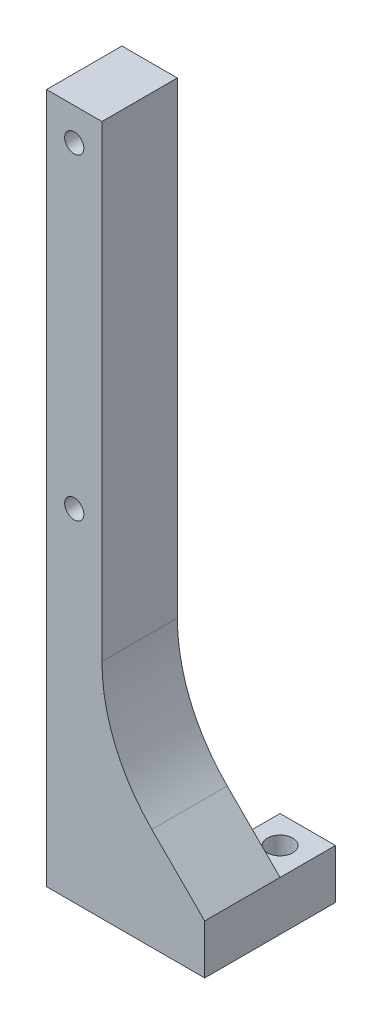
ISO-10303-21;
HEADER;
FILE_DESCRIPTION(('STEP AP214'),'2;1');
FILE_NAME('part.step','',(''),(''),'','','');
FILE_SCHEMA(('AUTOMOTIVE_DESIGN { 1 0 10303 214 1 1 1 1 }'));
ENDSEC;
DATA;
#1=APPLICATION_CONTEXT('core data for automotive mechanical design processes');
#2=APPLICATION_PROTOCOL_DEFINITION('international standard','automotive_design',2000,#1);
#3=PRODUCT_CONTEXT('',#1,'mechanical');
#4=PRODUCT('Part','Part','',(#3));
#5=PRODUCT_RELATED_PRODUCT_CATEGORY('part','',(#4));
#6=PRODUCT_DEFINITION_FORMATION('','',#4);
#7=PRODUCT_DEFINITION_CONTEXT('part definition',#1,'design');
#8=PRODUCT_DEFINITION('design','',#6,#7);
#9=PRODUCT_DEFINITION_SHAPE('','',#8);
#10=(LENGTH_UNIT() NAMED_UNIT(*) SI_UNIT(.MILLI.,.METRE.));
#11=(NAMED_UNIT(*) PLANE_ANGLE_UNIT() SI_UNIT($,.RADIAN.));
#12=(NAMED_UNIT(*) SI_UNIT($,.STERADIAN.) SOLID_ANGLE_UNIT());
#13=UNCERTAINTY_MEASURE_WITH_UNIT(LENGTH_MEASURE(1.E-05),#10,'distance_accuracy_value','');
#14=(GEOMETRIC_REPRESENTATION_CONTEXT(3) GLOBAL_UNCERTAINTY_ASSIGNED_CONTEXT((#13)) GLOBAL_UNIT_ASSIGNED_CONTEXT((#10,
#11,#12)) REPRESENTATION_CONTEXT('',''));
#15=CARTESIAN_POINT('',(0.,0.,0.));
#16=DIRECTION('',(0.,0.,1.));
#17=DIRECTION('',(1.,0.,0.));
#18=AXIS2_PLACEMENT_3D('',#15,#16,#17);
#19=CARTESIAN_POINT('',(18.56,40.05,-3.25));
#20=DIRECTION('',(0.,0.,1.));
#21=DIRECTION('',(-1.,0.,0.));
#22=AXIS2_PLACEMENT_3D('',#19,#20,#21);
#23=CYLINDRICAL_SURFACE('',#22,1.125);
#24=CARTESIAN_POINT('',(18.56,40.05,12.1));
#25=DIRECTION('',(0.,0.,-1.));
#26=DIRECTION('',(-1.,0.,0.));
#27=AXIS2_PLACEMENT_3D('',#24,#25,#26);
#28=CIRCLE('',#27,1.125);
#29=CARTESIAN_POINT('',(17.435,40.05,12.1));
#30=VERTEX_POINT('',#29);
#31=EDGE_CURVE('E234',#30,#30,#28,.T.);
#32=ORIENTED_EDGE('',*,*,#31,.F.);
#33=EDGE_LOOP('',(#32));
#34=FACE_BOUND('',#33,.T.);
#35=CARTESIAN_POINT('',(18.56,40.05,5.25));
#36=DIRECTION('',(0.,0.,1.));
#37=DIRECTION('',(1.,0.,0.));
#38=AXIS2_PLACEMENT_3D('',#35,#36,#37);
#39=CIRCLE('',#38,1.125);
#40=CARTESIAN_POINT('',(19.685,40.05,5.25));
#41=VERTEX_POINT('',#40);
#42=EDGE_CURVE('E242',#41,#41,#39,.F.);
#43=ORIENTED_EDGE('',*,*,#42,.T.);
#44=EDGE_LOOP('',(#43));
#45=FACE_BOUND('',#44,.T.);
#46=ADVANCED_FACE('F37',(#34,#45),#23,.F.);
#47=CARTESIAN_POINT('',(18.56,77.25,-3.25));
#48=DIRECTION('',(0.,0.,1.));
#49=DIRECTION('',(-1.,0.,0.));
#50=AXIS2_PLACEMENT_3D('',#47,#48,#49);
#51=CYLINDRICAL_SURFACE('',#50,1.125);
#52=CARTESIAN_POINT('',(18.56,77.25,12.1));
#53=DIRECTION('',(0.,0.,-1.));
#54=DIRECTION('',(-1.,0.,0.));
#55=AXIS2_PLACEMENT_3D('',#52,#53,#54);
#56=CIRCLE('',#55,1.125);
#57=CARTESIAN_POINT('',(17.435,77.25,12.1));
#58=VERTEX_POINT('',#57);
#59=EDGE_CURVE('E285',#58,#58,#56,.T.);
#60=ORIENTED_EDGE('',*,*,#59,.F.);
#61=EDGE_LOOP('',(#60));
#62=FACE_BOUND('',#61,.T.);
#63=CARTESIAN_POINT('',(18.56,77.25,5.25));
#64=DIRECTION('',(0.,0.,1.));
#65=DIRECTION('',(1.,0.,0.));
#66=AXIS2_PLACEMENT_3D('',#63,#64,#65);
#67=CIRCLE('',#66,1.125);
#68=CARTESIAN_POINT('',(19.685,77.25,5.25));
#69=VERTEX_POINT('',#68);
#70=EDGE_CURVE('E206',#69,#69,#67,.F.);
#71=ORIENTED_EDGE('',*,*,#70,.T.);
#72=EDGE_LOOP('',(#71));
#73=FACE_BOUND('',#72,.T.);
#74=ADVANCED_FACE('F424',(#62,#73),#51,.F.);
#75=CARTESIAN_POINT('',(41.81,26.1442712474619,-13.8054155622195));
#76=DIRECTION('',(0.,0.,1.));
#77=DIRECTION('',(-1.,0.,0.));
#78=AXIS2_PLACEMENT_3D('',#75,#76,#77);
#79=CYLINDRICAL_SURFACE('',#78,20.);
#80=DIRECTION('',(0.,0.,-1.));
#81=VECTOR('',#80,1.);
#82=CARTESIAN_POINT('',(27.667864376269,12.002135623731,-13.8054155622195));
#83=LINE('',#82,#81);
#84=CARTESIAN_POINT('',(27.6678643762691,12.002135623731,12.1));
#85=VERTEX_POINT('',#84);
#86=CARTESIAN_POINT('',(27.6678643762691,12.002135623731,3.24999999999999));
#87=VERTEX_POINT('',#86);
#88=EDGE_CURVE('E359',#85,#87,#83,.T.);
#89=ORIENTED_EDGE('',*,*,#88,.T.);
#90=CARTESIAN_POINT('',(41.81,26.1442712474619,3.24999999999999));
#91=DIRECTION('',(0.,0.,1.));
#92=DIRECTION('',(1.,0.,0.));
#93=AXIS2_PLACEMENT_3D('',#90,#91,#92);
#94=CIRCLE('',#93,20.);
#95=CARTESIAN_POINT('',(21.81,26.1442712474619,3.25));
#96=VERTEX_POINT('',#95);
#97=EDGE_CURVE('E11',#96,#87,#94,.T.);
#98=ORIENTED_EDGE('',*,*,#97,.F.);
#99=DIRECTION('',(0.,0.,-1.));
#100=VECTOR('',#99,1.);
#101=CARTESIAN_POINT('',(21.81,26.1442712474619,-13.8054155622195));
#102=LINE('',#101,#100);
#103=CARTESIAN_POINT('',(21.81,26.1442712474619,12.1));
#104=VERTEX_POINT('',#103);
#105=EDGE_CURVE('E362',#96,#104,#102,.F.);
#106=ORIENTED_EDGE('',*,*,#105,.T.);
#107=CARTESIAN_POINT('',(41.81,26.1442712474619,12.1));
#108=DIRECTION('',(0.,0.,-1.));
#109=DIRECTION('',(-1.,0.,0.));
#110=AXIS2_PLACEMENT_3D('',#107,#108,#109);
#111=CIRCLE('',#110,20.);
#112=EDGE_CURVE('E45',#85,#104,#111,.T.);
#113=ORIENTED_EDGE('',*,*,#112,.F.);
#114=EDGE_LOOP('',(#89,#98,#106,#113));
#115=FACE_BOUND('',#114,.T.);
#116=ADVANCED_FACE('F39',(#115),#79,.F.);
#117=CARTESIAN_POINT('',(30.62,5.8,0.));
#118=DIRECTION('',(0.,1.,0.));
#119=DIRECTION('',(0.,0.,1.));
#120=AXIS2_PLACEMENT_3D('',#117,#118,#119);
#121=PLANE('',#120);
#122=DIRECTION('',(-1.,0.,0.));
#123=VECTOR('',#122,1.);
#124=CARTESIAN_POINT('',(33.87,5.8,3.24999999999999));
#125=LINE('',#124,#123);
#126=CARTESIAN_POINT('',(33.87,5.8,3.24999999999999));
#127=VERTEX_POINT('',#126);
#128=CARTESIAN_POINT('',(27.37,5.8,3.24999999999999));
#129=VERTEX_POINT('',#128);
#130=EDGE_CURVE('E292',#127,#129,#125,.T.);
#131=ORIENTED_EDGE('',*,*,#130,.F.);
#132=DIRECTION('',(0.,0.,1.));
#133=VECTOR('',#132,1.);
#134=CARTESIAN_POINT('',(33.87,5.8,3.24999999999999));
#135=LINE('',#134,#133);
#136=CARTESIAN_POINT('',(33.87,5.8,-3.25000000000001));
#137=VERTEX_POINT('',#136);
#138=EDGE_CURVE('E341',#137,#127,#135,.T.);
#139=ORIENTED_EDGE('',*,*,#138,.F.);
#140=DIRECTION('',(1.,0.,0.));
#141=VECTOR('',#140,1.);
#142=CARTESIAN_POINT('',(33.87,5.8,-3.25000000000001));
#143=LINE('',#142,#141);
#144=CARTESIAN_POINT('',(27.37,5.8,-3.25));
#145=VERTEX_POINT('',#144);
#146=EDGE_CURVE('E338',#145,#137,#143,.T.);
#147=ORIENTED_EDGE('',*,*,#146,.F.);
#148=DIRECTION('',(0.,0.,-1.));
#149=VECTOR('',#148,1.);
#150=CARTESIAN_POINT('',(27.37,5.8,3.25));
#151=LINE('',#150,#149);
#152=EDGE_CURVE('E345',#129,#145,#151,.T.);
#153=ORIENTED_EDGE('',*,*,#152,.F.);
#154=EDGE_LOOP('',(#131,#139,#147,#153));
#155=FACE_BOUND('',#154,.T.);
#156=CARTESIAN_POINT('',(30.62,5.8,0.));
#157=DIRECTION('',(0.,-1.,0.));
#158=DIRECTION('',(0.,0.,1.));
#159=AXIS2_PLACEMENT_3D('',#156,#157,#158);
#160=CIRCLE('',#159,1.5);
#161=CARTESIAN_POINT('',(30.62,5.8,1.5));
#162=VERTEX_POINT('',#161);
#163=EDGE_CURVE('E332',#162,#162,#160,.T.);
#164=ORIENTED_EDGE('',*,*,#163,.T.);
#165=EDGE_LOOP('',(#164));
#166=FACE_BOUND('',#165,.T.);
#167=ADVANCED_FACE('F409',(#155,#166),#121,.T.);
#168=CARTESIAN_POINT('',(30.62,0.,0.));
#169=DIRECTION('',(0.,1.,0.));
#170=DIRECTION('',(0.,0.,1.));
#171=AXIS2_PLACEMENT_3D('',#168,#169,#170);
#172=PLANE('',#171);
#173=DIRECTION('',(1.,0.,0.));
#174=VECTOR('',#173,1.);
#175=CARTESIAN_POINT('',(33.87,0.,-3.25000000000001));
#176=LINE('',#175,#174);
#177=CARTESIAN_POINT('',(27.37,0.,-3.25));
#178=VERTEX_POINT('',#177);
#179=CARTESIAN_POINT('',(33.87,0.,-3.25000000000001));
#180=VERTEX_POINT('',#179);
#181=EDGE_CURVE('E335',#178,#180,#176,.T.);
#182=ORIENTED_EDGE('',*,*,#181,.T.);
#183=DIRECTION('',(0.,0.,1.));
#184=VECTOR('',#183,1.);
#185=CARTESIAN_POINT('',(33.87,0.,3.24999999999999));
#186=LINE('',#185,#184);
#187=CARTESIAN_POINT('',(33.87,0.,12.1));
#188=VERTEX_POINT('',#187);
#189=EDGE_CURVE('E351',#180,#188,#186,.T.);
#190=ORIENTED_EDGE('',*,*,#189,.T.);
#191=DIRECTION('',(-1.,0.,0.));
#192=VECTOR('',#191,1.);
#193=CARTESIAN_POINT('',(27.37,0.,12.1));
#194=LINE('',#193,#192);
#195=CARTESIAN_POINT('',(15.31,0.,12.1));
#196=VERTEX_POINT('',#195);
#197=EDGE_CURVE('E328',#188,#196,#194,.T.);
#198=ORIENTED_EDGE('',*,*,#197,.T.);
#199=DIRECTION('',(0.,0.,-1.));
#200=VECTOR('',#199,1.);
#201=CARTESIAN_POINT('',(15.31,0.,0.));
#202=LINE('',#201,#200);
#203=CARTESIAN_POINT('',(15.31,0.,3.25));
#204=VERTEX_POINT('',#203);
#205=EDGE_CURVE('E319',#196,#204,#202,.T.);
#206=ORIENTED_EDGE('',*,*,#205,.T.);
#207=DIRECTION('',(1.,0.,0.));
#208=VECTOR('',#207,1.);
#209=CARTESIAN_POINT('',(15.31,0.,3.25));
#210=LINE('',#209,#208);
#211=CARTESIAN_POINT('',(27.37,0.,3.24999999999999));
#212=VERTEX_POINT('',#211);
#213=EDGE_CURVE('E322',#204,#212,#210,.T.);
#214=ORIENTED_EDGE('',*,*,#213,.T.);
#215=DIRECTION('',(0.,0.,-1.));
#216=VECTOR('',#215,1.);
#217=CARTESIAN_POINT('',(27.37,0.,3.25));
#218=LINE('',#217,#216);
#219=EDGE_CURVE('E342',#212,#178,#218,.T.);
#220=ORIENTED_EDGE('',*,*,#219,.T.);
#221=EDGE_LOOP('',(#182,#190,#198,#206,#214,#220));
#222=FACE_BOUND('',#221,.T.);
#223=CARTESIAN_POINT('',(30.62,0.,0.));
#224=DIRECTION('',(0.,-1.,0.));
#225=DIRECTION('',(0.,0.,1.));
#226=AXIS2_PLACEMENT_3D('',#223,#224,#225);
#227=CIRCLE('',#226,1.5);
#228=CARTESIAN_POINT('',(30.62,0.,1.5));
#229=VERTEX_POINT('',#228);
#230=EDGE_CURVE('E331',#229,#229,#227,.T.);
#231=ORIENTED_EDGE('',*,*,#230,.F.);
#232=EDGE_LOOP('',(#231));
#233=FACE_BOUND('',#232,.T.);
#234=ADVANCED_FACE('F389',(#222,#233),#172,.F.);
#235=CARTESIAN_POINT('',(33.87,5.8,-3.25000000000001));
#236=DIRECTION('',(0.,0.,1.));
#237=DIRECTION('',(-1.,0.,0.));
#238=AXIS2_PLACEMENT_3D('',#235,#236,#237);
#239=PLANE('',#238);
#240=ORIENTED_EDGE('',*,*,#181,.F.);
#241=DIRECTION('',(0.,-1.,0.));
#242=VECTOR('',#241,1.);
#243=CARTESIAN_POINT('',(27.37,5.8,-3.25));
#244=LINE('',#243,#242);
#245=EDGE_CURVE('E348',#145,#178,#244,.T.);
#246=ORIENTED_EDGE('',*,*,#245,.F.);
#247=ORIENTED_EDGE('',*,*,#146,.T.);
#248=DIRECTION('',(0.,-1.,0.));
#249=VECTOR('',#248,1.);
#250=CARTESIAN_POINT('',(33.87,5.8,-3.25000000000001));
#251=LINE('',#250,#249);
#252=EDGE_CURVE('E357',#137,#180,#251,.T.);
#253=ORIENTED_EDGE('',*,*,#252,.T.);
#254=EDGE_LOOP('',(#240,#246,#247,#253));
#255=FACE_BOUND('',#254,.T.);
#256=ADVANCED_FACE('F405',(#255),#239,.F.);
#257=CARTESIAN_POINT('',(33.87,5.8,3.24999999999999));
#258=DIRECTION('',(-1.,0.,0.));
#259=DIRECTION('',(0.,0.,-1.));
#260=AXIS2_PLACEMENT_3D('',#257,#258,#259);
#261=PLANE('',#260);
#262=ORIENTED_EDGE('',*,*,#189,.F.);
#263=ORIENTED_EDGE('',*,*,#252,.F.);
#264=ORIENTED_EDGE('',*,*,#138,.T.);
#265=DIRECTION('',(0.,0.,1.));
#266=VECTOR('',#265,1.);
#267=CARTESIAN_POINT('',(33.87,5.8,-13.8054155622195));
#268=LINE('',#267,#266);
#269=CARTESIAN_POINT('',(33.87,5.8,12.1));
#270=VERTEX_POINT('',#269);
#271=EDGE_CURVE('E297',#127,#270,#268,.T.);
#272=ORIENTED_EDGE('',*,*,#271,.T.);
#273=DIRECTION('',(0.,-1.,0.));
#274=VECTOR('',#273,1.);
#275=CARTESIAN_POINT('',(33.87,0.,12.1));
#276=LINE('',#275,#274);
#277=EDGE_CURVE('E326',#270,#188,#276,.T.);
#278=ORIENTED_EDGE('',*,*,#277,.T.);
#279=EDGE_LOOP('',(#262,#263,#264,#272,#278));
#280=FACE_BOUND('',#279,.T.);
#281=ADVANCED_FACE('F394',(#280),#261,.F.);
#282=CARTESIAN_POINT('',(27.37,5.8,3.25));
#283=DIRECTION('',(1.,0.,0.));
#284=DIRECTION('',(0.,0.,1.));
#285=AXIS2_PLACEMENT_3D('',#282,#283,#284);
#286=PLANE('',#285);
#287=ORIENTED_EDGE('',*,*,#152,.T.);
#288=ORIENTED_EDGE('',*,*,#245,.T.);
#289=ORIENTED_EDGE('',*,*,#219,.F.);
#290=DIRECTION('',(0.,-1.,0.));
#291=VECTOR('',#290,1.);
#292=CARTESIAN_POINT('',(27.37,0.,3.24999999999999));
#293=LINE('',#292,#291);
#294=EDGE_CURVE('E314',#129,#212,#293,.T.);
#295=ORIENTED_EDGE('',*,*,#294,.F.);
#296=EDGE_LOOP('',(#287,#288,#289,#295));
#297=FACE_BOUND('',#296,.T.);
#298=ADVANCED_FACE('F411',(#297),#286,.F.);
#299=CARTESIAN_POINT('',(30.62,5.8,0.));
#300=DIRECTION('',(0.,-1.,0.));
#301=DIRECTION('',(0.,0.,-1.));
#302=AXIS2_PLACEMENT_3D('',#299,#300,#301);
#303=CYLINDRICAL_SURFACE('',#302,1.5);
#304=ORIENTED_EDGE('',*,*,#163,.F.);
#305=EDGE_LOOP('',(#304));
#306=FACE_BOUND('',#305,.T.);
#307=ORIENTED_EDGE('',*,*,#230,.T.);
#308=EDGE_LOOP('',(#307));
#309=FACE_BOUND('',#308,.T.);
#310=ADVANCED_FACE('F413',(#306,#309),#303,.F.);
#311=CARTESIAN_POINT('',(30.62,0.,12.1));
#312=DIRECTION('',(0.,0.,1.));
#313=DIRECTION('',(-1.,0.,0.));
#314=AXIS2_PLACEMENT_3D('',#311,#312,#313);
#315=PLANE('',#314);
#316=ORIENTED_EDGE('',*,*,#59,.T.);
#317=EDGE_LOOP('',(#316));
#318=FACE_BOUND('',#317,.T.);
#319=ORIENTED_EDGE('',*,*,#31,.T.);
#320=EDGE_LOOP('',(#319));
#321=FACE_BOUND('',#320,.T.);
#322=ORIENTED_EDGE('',*,*,#112,.T.);
#323=DIRECTION('',(0.,-1.,0.));
#324=VECTOR('',#323,1.);
#325=CARTESIAN_POINT('',(21.81,81.05,12.1));
#326=LINE('',#325,#324);
#327=CARTESIAN_POINT('',(21.81,81.05,12.1));
#328=VERTEX_POINT('',#327);
#329=EDGE_CURVE('E312',#328,#104,#326,.T.);
#330=ORIENTED_EDGE('',*,*,#329,.F.);
#331=DIRECTION('',(-1.,0.,0.));
#332=VECTOR('',#331,1.);
#333=CARTESIAN_POINT('',(30.62,81.05,12.1));
#334=LINE('',#333,#332);
#335=CARTESIAN_POINT('',(15.31,81.05,12.1));
#336=VERTEX_POINT('',#335);
#337=EDGE_CURVE('E302',#328,#336,#334,.T.);
#338=ORIENTED_EDGE('',*,*,#337,.T.);
#339=DIRECTION('',(0.,-1.,0.));
#340=VECTOR('',#339,1.);
#341=CARTESIAN_POINT('',(15.31,0.,12.1));
#342=LINE('',#341,#340);
#343=EDGE_CURVE('E317',#336,#196,#342,.T.);
#344=ORIENTED_EDGE('',*,*,#343,.T.);
#345=ORIENTED_EDGE('',*,*,#197,.F.);
#346=ORIENTED_EDGE('',*,*,#277,.F.);
#347=DIRECTION('',(0.707106781186548,-0.707106781186548,0.));
#348=VECTOR('',#347,1.);
#349=CARTESIAN_POINT('',(33.87,5.8,12.1));
#350=LINE('',#349,#348);
#351=EDGE_CURVE('E288',#85,#270,#350,.T.);
#352=ORIENTED_EDGE('',*,*,#351,.F.);
#353=EDGE_LOOP('',(#322,#330,#338,#344,#345,#346,#352));
#354=FACE_BOUND('',#353,.T.);
#355=ADVANCED_FACE('F368',(#318,#321,#354),#315,.T.);
#356=CARTESIAN_POINT('',(15.31,0.,3.25));
#357=DIRECTION('',(0.,0.,-1.));
#358=DIRECTION('',(1.,0.,0.));
#359=AXIS2_PLACEMENT_3D('',#356,#357,#358);
#360=PLANE('',#359);
#361=DIRECTION('',(0.,1.,0.));
#362=VECTOR('',#361,1.);
#363=CARTESIAN_POINT('',(20.5085571585156,0.,3.25));
#364=LINE('',#363,#362);
#365=CARTESIAN_POINT('',(20.508557158515,76.125,3.25));
#366=VERTEX_POINT('',#365);
#367=CARTESIAN_POINT('',(20.508557158515,78.3750000000001,3.25));
#368=VERTEX_POINT('',#367);
#369=EDGE_CURVE('E218',#366,#368,#364,.T.);
#370=ORIENTED_EDGE('',*,*,#369,.T.);
#371=DIRECTION('',(-0.866025403784444,0.499999999999991,0.));
#372=VECTOR('',#371,1.);
#373=CARTESIAN_POINT('',(62.0295098004312,54.4028668151806,3.24999999999999));
#374=LINE('',#373,#372);
#375=CARTESIAN_POINT('',(18.56,79.5,3.25));
#376=VERTEX_POINT('',#375);
#377=EDGE_CURVE('E199',#368,#376,#374,.T.);
#378=ORIENTED_EDGE('',*,*,#377,.T.);
#379=DIRECTION('',(-0.866025403784432,-0.500000000000011,0.));
#380=VECTOR('',#379,1.);
#381=CARTESIAN_POINT('',(-6.81950980043209,64.8471331848194,3.25));
#382=LINE('',#381,#380);
#383=CARTESIAN_POINT('',(16.611442841485,78.375,3.25));
#384=VERTEX_POINT('',#383);
#385=EDGE_CURVE('E222',#376,#384,#382,.T.);
#386=ORIENTED_EDGE('',*,*,#385,.T.);
#387=DIRECTION('',(0.,-1.,0.));
#388=VECTOR('',#387,1.);
#389=CARTESIAN_POINT('',(16.6114428414857,-1.18804756729695E-13,3.25));
#390=LINE('',#389,#388);
#391=CARTESIAN_POINT('',(16.611442841485,76.125,3.25));
#392=VERTEX_POINT('',#391);
#393=EDGE_CURVE('E225',#384,#392,#390,.T.);
#394=ORIENTED_EDGE('',*,*,#393,.T.);
#395=DIRECTION('',(0.866025403784445,-0.499999999999989,0.));
#396=VECTOR('',#395,1.);
#397=CARTESIAN_POINT('',(60.0809526419161,51.0278668151807,3.24999999999999));
#398=LINE('',#397,#396);
#399=CARTESIAN_POINT('',(18.56,75.,3.25));
#400=VERTEX_POINT('',#399);
#401=EDGE_CURVE('E228',#392,#400,#398,.T.);
#402=ORIENTED_EDGE('',*,*,#401,.T.);
#403=DIRECTION('',(0.866025403784434,0.500000000000009,0.));
#404=VECTOR('',#403,1.);
#405=CARTESIAN_POINT('',(-4.8709526419169,61.4721331848196,3.25));
#406=LINE('',#405,#404);
#407=EDGE_CURVE('E209',#400,#366,#406,.T.);
#408=ORIENTED_EDGE('',*,*,#407,.T.);
#409=EDGE_LOOP('',(#370,#378,#386,#394,#402,#408));
#410=FACE_BOUND('',#409,.T.);
#411=DIRECTION('',(0.,1.,0.));
#412=VECTOR('',#411,1.);
#413=CARTESIAN_POINT('',(20.5085571585154,-1.09141245254975E-13,3.25));
#414=LINE('',#413,#412);
#415=CARTESIAN_POINT('',(20.508557158515,38.925,3.25));
#416=VERTEX_POINT('',#415);
#417=CARTESIAN_POINT('',(20.508557158515,41.175,3.25));
#418=VERTEX_POINT('',#417);
#419=EDGE_CURVE('E258',#416,#418,#414,.T.);
#420=ORIENTED_EDGE('',*,*,#419,.T.);
#421=DIRECTION('',(-0.866025403784441,0.499999999999996,0.));
#422=VECTOR('',#421,1.);
#423=CARTESIAN_POINT('',(45.9214372900408,26.50286681518,3.24999999999999));
#424=LINE('',#423,#422);
#425=CARTESIAN_POINT('',(18.56,42.3,3.25));
#426=VERTEX_POINT('',#425);
#427=EDGE_CURVE('E261',#418,#426,#424,.T.);
#428=ORIENTED_EDGE('',*,*,#427,.T.);
#429=DIRECTION('',(-0.866025403784438,-0.500000000000002,0.));
#430=VECTOR('',#429,1.);
#431=CARTESIAN_POINT('',(9.28856270995905,36.9471331848201,3.25));
#432=LINE('',#431,#430);
#433=CARTESIAN_POINT('',(16.611442841485,41.175,3.25));
#434=VERTEX_POINT('',#433);
#435=EDGE_CURVE('E264',#426,#434,#432,.T.);
#436=ORIENTED_EDGE('',*,*,#435,.T.);
#437=DIRECTION('',(0.,-1.,0.));
#438=VECTOR('',#437,1.);
#439=CARTESIAN_POINT('',(16.6114428414852,0.,3.25));
#440=LINE('',#439,#438);
#441=CARTESIAN_POINT('',(16.611442841485,38.925,3.25));
#442=VERTEX_POINT('',#441);
#443=EDGE_CURVE('E267',#434,#442,#440,.T.);
#444=ORIENTED_EDGE('',*,*,#443,.T.);
#445=DIRECTION('',(0.866025403784441,-0.499999999999996,0.));
#446=VECTOR('',#445,1.);
#447=CARTESIAN_POINT('',(43.9728801315259,23.12786681518,3.24999999999999));
#448=LINE('',#447,#446);
#449=CARTESIAN_POINT('',(18.56,37.8,3.25));
#450=VERTEX_POINT('',#449);
#451=EDGE_CURVE('E270',#442,#450,#448,.T.);
#452=ORIENTED_EDGE('',*,*,#451,.T.);
#453=DIRECTION('',(0.866025403784434,0.500000000000008,0.));
#454=VECTOR('',#453,1.);
#455=CARTESIAN_POINT('',(11.2371198684739,33.5721331848199,3.25));
#456=LINE('',#455,#454);
#457=EDGE_CURVE('E246',#450,#416,#456,.T.);
#458=ORIENTED_EDGE('',*,*,#457,.T.);
#459=EDGE_LOOP('',(#420,#428,#436,#444,#452,#458));
#460=FACE_BOUND('',#459,.T.);
#461=ORIENTED_EDGE('',*,*,#294,.T.);
#462=ORIENTED_EDGE('',*,*,#213,.F.);
#463=DIRECTION('',(0.,-1.,0.));
#464=VECTOR('',#463,1.);
#465=CARTESIAN_POINT('',(15.31,0.,3.25));
#466=LINE('',#465,#464);
#467=CARTESIAN_POINT('',(15.31,81.05,3.25));
#468=VERTEX_POINT('',#467);
#469=EDGE_CURVE('E315',#468,#204,#466,.T.);
#470=ORIENTED_EDGE('',*,*,#469,.F.);
#471=DIRECTION('',(1.,0.,0.));
#472=VECTOR('',#471,1.);
#473=CARTESIAN_POINT('',(30.62,81.05,3.24999999999999));
#474=LINE('',#473,#472);
#475=CARTESIAN_POINT('',(21.81,81.05,3.25));
#476=VERTEX_POINT('',#475);
#477=EDGE_CURVE('E307',#468,#476,#474,.T.);
#478=ORIENTED_EDGE('',*,*,#477,.T.);
#479=DIRECTION('',(0.,-1.,0.));
#480=VECTOR('',#479,1.);
#481=CARTESIAN_POINT('',(21.81,81.05,3.25));
#482=LINE('',#481,#480);
#483=EDGE_CURVE('E310',#476,#96,#482,.T.);
#484=ORIENTED_EDGE('',*,*,#483,.T.);
#485=ORIENTED_EDGE('',*,*,#97,.T.);
#486=DIRECTION('',(0.707106781186548,-0.707106781186548,0.));
#487=VECTOR('',#486,1.);
#488=CARTESIAN_POINT('',(33.87,5.8,3.24999999999999));
#489=LINE('',#488,#487);
#490=EDGE_CURVE('E295',#87,#127,#489,.T.);
#491=ORIENTED_EDGE('',*,*,#490,.T.);
#492=ORIENTED_EDGE('',*,*,#130,.T.);
#493=EDGE_LOOP('',(#461,#462,#470,#478,#484,#485,#491,#492));
#494=FACE_BOUND('',#493,.T.);
#495=ADVANCED_FACE('F401',(#410,#460,#494),#360,.T.);
#496=CARTESIAN_POINT('',(15.31,0.,0.));
#497=DIRECTION('',(-1.,0.,0.));
#498=DIRECTION('',(0.,0.,-1.));
#499=AXIS2_PLACEMENT_3D('',#496,#497,#498);
#500=PLANE('',#499);
#501=ORIENTED_EDGE('',*,*,#469,.T.);
#502=ORIENTED_EDGE('',*,*,#205,.F.);
#503=ORIENTED_EDGE('',*,*,#343,.F.);
#504=DIRECTION('',(0.,0.,-1.));
#505=VECTOR('',#504,1.);
#506=CARTESIAN_POINT('',(15.31,81.05,0.));
#507=LINE('',#506,#505);
#508=EDGE_CURVE('E305',#336,#468,#507,.T.);
#509=ORIENTED_EDGE('',*,*,#508,.T.);
#510=EDGE_LOOP('',(#501,#502,#503,#509));
#511=FACE_BOUND('',#510,.T.);
#512=ADVANCED_FACE('F385',(#511),#500,.T.);
#513=CARTESIAN_POINT('',(21.81,81.05,0.));
#514=DIRECTION('',(1.,0.,0.));
#515=DIRECTION('',(0.,0.,1.));
#516=AXIS2_PLACEMENT_3D('',#513,#514,#515);
#517=PLANE('',#516);
#518=ORIENTED_EDGE('',*,*,#483,.F.);
#519=DIRECTION('',(0.,0.,-1.));
#520=VECTOR('',#519,1.);
#521=CARTESIAN_POINT('',(21.81,81.05,0.));
#522=LINE('',#521,#520);
#523=EDGE_CURVE('E300',#328,#476,#522,.T.);
#524=ORIENTED_EDGE('',*,*,#523,.F.);
#525=ORIENTED_EDGE('',*,*,#329,.T.);
#526=ORIENTED_EDGE('',*,*,#105,.F.);
#527=EDGE_LOOP('',(#518,#524,#525,#526));
#528=FACE_BOUND('',#527,.T.);
#529=ADVANCED_FACE('F376',(#528),#517,.T.);
#530=CARTESIAN_POINT('',(30.62,81.05,0.));
#531=DIRECTION('',(0.,1.,0.));
#532=DIRECTION('',(0.,0.,1.));
#533=AXIS2_PLACEMENT_3D('',#530,#531,#532);
#534=PLANE('',#533);
#535=ORIENTED_EDGE('',*,*,#523,.T.);
#536=ORIENTED_EDGE('',*,*,#477,.F.);
#537=ORIENTED_EDGE('',*,*,#508,.F.);
#538=ORIENTED_EDGE('',*,*,#337,.F.);
#539=EDGE_LOOP('',(#535,#536,#537,#538));
#540=FACE_BOUND('',#539,.T.);
#541=ADVANCED_FACE('F380',(#540),#534,.T.);
#542=CARTESIAN_POINT('',(33.87,5.8,-13.8054155622195));
#543=DIRECTION('',(0.707106781186547,0.707106781186547,0.));
#544=DIRECTION('',(0.707106781186548,-0.707106781186548,0.));
#545=AXIS2_PLACEMENT_3D('',#542,#543,#544);
#546=PLANE('',#545);
#547=ORIENTED_EDGE('',*,*,#351,.T.);
#548=ORIENTED_EDGE('',*,*,#271,.F.);
#549=ORIENTED_EDGE('',*,*,#490,.F.);
#550=ORIENTED_EDGE('',*,*,#88,.F.);
#551=EDGE_LOOP('',(#547,#548,#549,#550));
#552=FACE_BOUND('',#551,.T.);
#553=ADVANCED_FACE('F399',(#552),#546,.T.);
#554=CARTESIAN_POINT('',(20.5085571585156,0.,5.25));
#555=DIRECTION('',(1.,0.,0.));
#556=DIRECTION('',(0.,-1.,0.));
#557=AXIS2_PLACEMENT_3D('',#554,#555,#556);
#558=PLANE('',#557);
#559=ORIENTED_EDGE('',*,*,#369,.F.);
#560=DIRECTION('',(0.,0.,-1.));
#561=VECTOR('',#560,1.);
#562=CARTESIAN_POINT('',(20.508557158515,76.125,5.25));
#563=LINE('',#562,#561);
#564=CARTESIAN_POINT('',(20.508557158515,76.125,5.25));
#565=VERTEX_POINT('',#564);
#566=EDGE_CURVE('E205',#565,#366,#563,.T.);
#567=ORIENTED_EDGE('',*,*,#566,.F.);
#568=DIRECTION('',(0.,1.,0.));
#569=VECTOR('',#568,1.);
#570=CARTESIAN_POINT('',(20.5085571585156,0.,5.25));
#571=LINE('',#570,#569);
#572=CARTESIAN_POINT('',(20.508557158515,78.3750000000001,5.25));
#573=VERTEX_POINT('',#572);
#574=EDGE_CURVE('E190',#565,#573,#571,.T.);
#575=ORIENTED_EDGE('',*,*,#574,.T.);
#576=DIRECTION('',(0.,0.,-1.));
#577=VECTOR('',#576,1.);
#578=CARTESIAN_POINT('',(20.508557158515,78.3750000000001,5.25));
#579=LINE('',#578,#577);
#580=EDGE_CURVE('E52',#573,#368,#579,.T.);
#581=ORIENTED_EDGE('',*,*,#580,.T.);
#582=EDGE_LOOP('',(#559,#567,#575,#581));
#583=FACE_BOUND('',#582,.T.);
#584=ADVANCED_FACE('F204',(#583),#558,.F.);
#585=CARTESIAN_POINT('',(-4.8709526419169,61.4721331848196,5.25));
#586=DIRECTION('',(0.500000000000008,-0.866025403784434,0.));
#587=DIRECTION('',(-0.866025403784434,-0.500000000000009,0.));
#588=AXIS2_PLACEMENT_3D('',#585,#586,#587);
#589=PLANE('',#588);
#590=ORIENTED_EDGE('',*,*,#407,.F.);
#591=DIRECTION('',(0.,0.,-1.));
#592=VECTOR('',#591,1.);
#593=CARTESIAN_POINT('',(18.56,75.,5.25));
#594=LINE('',#593,#592);
#595=CARTESIAN_POINT('',(18.56,75.,5.25));
#596=VERTEX_POINT('',#595);
#597=EDGE_CURVE('E235',#596,#400,#594,.T.);
#598=ORIENTED_EDGE('',*,*,#597,.F.);
#599=DIRECTION('',(0.866025403784434,0.500000000000009,0.));
#600=VECTOR('',#599,1.);
#601=CARTESIAN_POINT('',(-4.8709526419169,61.4721331848196,5.25));
#602=LINE('',#601,#600);
#603=EDGE_CURVE('E202',#596,#565,#602,.T.);
#604=ORIENTED_EDGE('',*,*,#603,.T.);
#605=ORIENTED_EDGE('',*,*,#566,.T.);
#606=EDGE_LOOP('',(#590,#598,#604,#605));
#607=FACE_BOUND('',#606,.T.);
#608=ADVANCED_FACE('F524',(#607),#589,.F.);
#609=CARTESIAN_POINT('',(60.0809526419161,51.0278668151807,5.24999999999999));
#610=DIRECTION('',(-0.499999999999989,-0.866025403784445,0.));
#611=DIRECTION('',(-0.866025403784445,0.499999999999989,0.));
#612=AXIS2_PLACEMENT_3D('',#609,#610,#611);
#613=PLANE('',#612);
#614=ORIENTED_EDGE('',*,*,#401,.F.);
#615=DIRECTION('',(0.,0.,-1.));
#616=VECTOR('',#615,1.);
#617=CARTESIAN_POINT('',(16.611442841485,76.125,5.25));
#618=LINE('',#617,#616);
#619=CARTESIAN_POINT('',(16.611442841485,76.125,5.25));
#620=VERTEX_POINT('',#619);
#621=EDGE_CURVE('E237',#620,#392,#618,.T.);
#622=ORIENTED_EDGE('',*,*,#621,.F.);
#623=DIRECTION('',(0.866025403784445,-0.499999999999989,0.));
#624=VECTOR('',#623,1.);
#625=CARTESIAN_POINT('',(60.0809526419161,51.0278668151807,5.24999999999999));
#626=LINE('',#625,#624);
#627=EDGE_CURVE('E215',#620,#596,#626,.T.);
#628=ORIENTED_EDGE('',*,*,#627,.T.);
#629=ORIENTED_EDGE('',*,*,#597,.T.);
#630=EDGE_LOOP('',(#614,#622,#628,#629));
#631=FACE_BOUND('',#630,.T.);
#632=ADVANCED_FACE('F533',(#631),#613,.F.);
#633=CARTESIAN_POINT('',(16.6114428414857,-1.18804756729695E-13,5.25));
#634=DIRECTION('',(-1.,0.,0.));
#635=DIRECTION('',(0.,1.,0.));
#636=AXIS2_PLACEMENT_3D('',#633,#634,#635);
#637=PLANE('',#636);
#638=ORIENTED_EDGE('',*,*,#393,.F.);
#639=DIRECTION('',(0.,0.,-1.));
#640=VECTOR('',#639,1.);
#641=CARTESIAN_POINT('',(16.611442841485,78.375,5.25));
#642=LINE('',#641,#640);
#643=CARTESIAN_POINT('',(16.611442841485,78.375,5.25));
#644=VERTEX_POINT('',#643);
#645=EDGE_CURVE('E239',#644,#384,#642,.T.);
#646=ORIENTED_EDGE('',*,*,#645,.F.);
#647=DIRECTION('',(0.,-1.,0.));
#648=VECTOR('',#647,1.);
#649=CARTESIAN_POINT('',(16.6114428414857,-1.18804756729695E-13,5.25));
#650=LINE('',#649,#648);
#651=EDGE_CURVE('E213',#644,#620,#650,.T.);
#652=ORIENTED_EDGE('',*,*,#651,.T.);
#653=ORIENTED_EDGE('',*,*,#621,.T.);
#654=EDGE_LOOP('',(#638,#646,#652,#653));
#655=FACE_BOUND('',#654,.T.);
#656=ADVANCED_FACE('F543',(#655),#637,.F.);
#657=CARTESIAN_POINT('',(-6.81950980043209,64.8471331848194,5.25));
#658=DIRECTION('',(-0.500000000000011,0.866025403784432,0.));
#659=DIRECTION('',(0.866025403784432,0.500000000000011,0.));
#660=AXIS2_PLACEMENT_3D('',#657,#658,#659);
#661=PLANE('',#660);
#662=ORIENTED_EDGE('',*,*,#385,.F.);
#663=DIRECTION('',(0.,0.,-1.));
#664=VECTOR('',#663,1.);
#665=CARTESIAN_POINT('',(18.56,79.5,5.25));
#666=LINE('',#665,#664);
#667=CARTESIAN_POINT('',(18.56,79.5,5.25));
#668=VERTEX_POINT('',#667);
#669=EDGE_CURVE('E201',#668,#376,#666,.T.);
#670=ORIENTED_EDGE('',*,*,#669,.F.);
#671=DIRECTION('',(-0.866025403784432,-0.500000000000011,0.));
#672=VECTOR('',#671,1.);
#673=CARTESIAN_POINT('',(-6.81950980043209,64.8471331848194,5.25));
#674=LINE('',#673,#672);
#675=EDGE_CURVE('E193',#668,#644,#674,.T.);
#676=ORIENTED_EDGE('',*,*,#675,.T.);
#677=ORIENTED_EDGE('',*,*,#645,.T.);
#678=EDGE_LOOP('',(#662,#670,#676,#677));
#679=FACE_BOUND('',#678,.T.);
#680=ADVANCED_FACE('F553',(#679),#661,.F.);
#681=CARTESIAN_POINT('',(62.0295098004312,54.4028668151806,5.24999999999999));
#682=DIRECTION('',(0.499999999999991,0.866025403784444,0.));
#683=DIRECTION('',(0.866025403784444,-0.499999999999991,0.));
#684=AXIS2_PLACEMENT_3D('',#681,#682,#683);
#685=PLANE('',#684);
#686=ORIENTED_EDGE('',*,*,#377,.F.);
#687=ORIENTED_EDGE('',*,*,#580,.F.);
#688=DIRECTION('',(-0.866025403784444,0.499999999999991,0.));
#689=VECTOR('',#688,1.);
#690=CARTESIAN_POINT('',(62.0295098004312,54.4028668151806,5.24999999999999));
#691=LINE('',#690,#689);
#692=EDGE_CURVE('E187',#573,#668,#691,.T.);
#693=ORIENTED_EDGE('',*,*,#692,.T.);
#694=ORIENTED_EDGE('',*,*,#669,.T.);
#695=EDGE_LOOP('',(#686,#687,#693,#694));
#696=FACE_BOUND('',#695,.T.);
#697=ADVANCED_FACE('F197',(#696),#685,.F.);
#698=CARTESIAN_POINT('',(30.62,0.,5.24999999999999));
#699=DIRECTION('',(0.,0.,-1.));
#700=DIRECTION('',(1.,0.,0.));
#701=AXIS2_PLACEMENT_3D('',#698,#699,#700);
#702=PLANE('',#701);
#703=ORIENTED_EDGE('',*,*,#70,.F.);
#704=EDGE_LOOP('',(#703));
#705=FACE_BOUND('',#704,.T.);
#706=ORIENTED_EDGE('',*,*,#574,.F.);
#707=ORIENTED_EDGE('',*,*,#603,.F.);
#708=ORIENTED_EDGE('',*,*,#627,.F.);
#709=ORIENTED_EDGE('',*,*,#651,.F.);
#710=ORIENTED_EDGE('',*,*,#675,.F.);
#711=ORIENTED_EDGE('',*,*,#692,.F.);
#712=EDGE_LOOP('',(#706,#707,#708,#709,#710,#711));
#713=FACE_BOUND('',#712,.T.);
#714=ADVANCED_FACE('F188',(#705,#713),#702,.T.);
#715=CARTESIAN_POINT('',(20.5085571585154,-1.09141245254975E-13,5.25));
#716=DIRECTION('',(1.,0.,0.));
#717=DIRECTION('',(0.,-1.,0.));
#718=AXIS2_PLACEMENT_3D('',#715,#716,#717);
#719=PLANE('',#718);
#720=ORIENTED_EDGE('',*,*,#419,.F.);
#721=DIRECTION('',(0.,0.,-1.));
#722=VECTOR('',#721,1.);
#723=CARTESIAN_POINT('',(20.508557158515,38.925,5.25));
#724=LINE('',#723,#722);
#725=CARTESIAN_POINT('',(20.508557158515,38.925,5.25));
#726=VERTEX_POINT('',#725);
#727=EDGE_CURVE('E220',#726,#416,#724,.T.);
#728=ORIENTED_EDGE('',*,*,#727,.F.);
#729=DIRECTION('',(0.,1.,0.));
#730=VECTOR('',#729,1.);
#731=CARTESIAN_POINT('',(20.5085571585154,-1.09141245254975E-13,5.25));
#732=LINE('',#731,#730);
#733=CARTESIAN_POINT('',(20.508557158515,41.175,5.25));
#734=VERTEX_POINT('',#733);
#735=EDGE_CURVE('E245',#726,#734,#732,.T.);
#736=ORIENTED_EDGE('',*,*,#735,.T.);
#737=DIRECTION('',(0.,0.,-1.));
#738=VECTOR('',#737,1.);
#739=CARTESIAN_POINT('',(20.508557158515,41.175,5.25));
#740=LINE('',#739,#738);
#741=EDGE_CURVE('E60',#734,#418,#740,.T.);
#742=ORIENTED_EDGE('',*,*,#741,.T.);
#743=EDGE_LOOP('',(#720,#728,#736,#742));
#744=FACE_BOUND('',#743,.T.);
#745=ADVANCED_FACE('F580',(#744),#719,.F.);
#746=CARTESIAN_POINT('',(11.2371198684739,33.5721331848199,5.25));
#747=DIRECTION('',(0.500000000000008,-0.866025403784434,0.));
#748=DIRECTION('',(-0.866025403784434,-0.500000000000008,0.));
#749=AXIS2_PLACEMENT_3D('',#746,#747,#748);
#750=PLANE('',#749);
#751=ORIENTED_EDGE('',*,*,#457,.F.);
#752=DIRECTION('',(0.,0.,-1.));
#753=VECTOR('',#752,1.);
#754=CARTESIAN_POINT('',(18.56,37.8,5.25));
#755=LINE('',#754,#753);
#756=CARTESIAN_POINT('',(18.56,37.8,5.25));
#757=VERTEX_POINT('',#756);
#758=EDGE_CURVE('E276',#757,#450,#755,.T.);
#759=ORIENTED_EDGE('',*,*,#758,.F.);
#760=DIRECTION('',(0.866025403784434,0.500000000000008,0.));
#761=VECTOR('',#760,1.);
#762=CARTESIAN_POINT('',(11.2371198684739,33.5721331848199,5.25));
#763=LINE('',#762,#761);
#764=EDGE_CURVE('E256',#757,#726,#763,.T.);
#765=ORIENTED_EDGE('',*,*,#764,.T.);
#766=ORIENTED_EDGE('',*,*,#727,.T.);
#767=EDGE_LOOP('',(#751,#759,#765,#766));
#768=FACE_BOUND('',#767,.T.);
#769=ADVANCED_FACE('F590',(#768),#750,.F.);
#770=CARTESIAN_POINT('',(43.9728801315259,23.12786681518,5.24999999999999));
#771=DIRECTION('',(-0.499999999999996,-0.866025403784441,0.));
#772=DIRECTION('',(-0.866025403784441,0.499999999999996,0.));
#773=AXIS2_PLACEMENT_3D('',#770,#771,#772);
#774=PLANE('',#773);
#775=ORIENTED_EDGE('',*,*,#451,.F.);
#776=DIRECTION('',(0.,0.,-1.));
#777=VECTOR('',#776,1.);
#778=CARTESIAN_POINT('',(16.611442841485,38.925,5.25));
#779=LINE('',#778,#777);
#780=CARTESIAN_POINT('',(16.611442841485,38.925,5.25));
#781=VERTEX_POINT('',#780);
#782=EDGE_CURVE('E278',#781,#442,#779,.T.);
#783=ORIENTED_EDGE('',*,*,#782,.F.);
#784=DIRECTION('',(0.866025403784441,-0.499999999999996,0.));
#785=VECTOR('',#784,1.);
#786=CARTESIAN_POINT('',(43.9728801315259,23.12786681518,5.24999999999999));
#787=LINE('',#786,#785);
#788=EDGE_CURVE('E254',#781,#757,#787,.T.);
#789=ORIENTED_EDGE('',*,*,#788,.T.);
#790=ORIENTED_EDGE('',*,*,#758,.T.);
#791=EDGE_LOOP('',(#775,#783,#789,#790));
#792=FACE_BOUND('',#791,.T.);
#793=ADVANCED_FACE('F598',(#792),#774,.F.);
#794=CARTESIAN_POINT('',(16.6114428414852,0.,5.25));
#795=DIRECTION('',(-1.,0.,0.));
#796=DIRECTION('',(0.,1.,0.));
#797=AXIS2_PLACEMENT_3D('',#794,#795,#796);
#798=PLANE('',#797);
#799=ORIENTED_EDGE('',*,*,#443,.F.);
#800=DIRECTION('',(0.,0.,-1.));
#801=VECTOR('',#800,1.);
#802=CARTESIAN_POINT('',(16.611442841485,41.175,5.25));
#803=LINE('',#802,#801);
#804=CARTESIAN_POINT('',(16.611442841485,41.175,5.25));
#805=VERTEX_POINT('',#804);
#806=EDGE_CURVE('E280',#805,#434,#803,.T.);
#807=ORIENTED_EDGE('',*,*,#806,.F.);
#808=DIRECTION('',(0.,-1.,0.));
#809=VECTOR('',#808,1.);
#810=CARTESIAN_POINT('',(16.6114428414852,0.,5.25));
#811=LINE('',#810,#809);
#812=EDGE_CURVE('E252',#805,#781,#811,.T.);
#813=ORIENTED_EDGE('',*,*,#812,.T.);
#814=ORIENTED_EDGE('',*,*,#782,.T.);
#815=EDGE_LOOP('',(#799,#807,#813,#814));
#816=FACE_BOUND('',#815,.T.);
#817=ADVANCED_FACE('F608',(#816),#798,.F.);
#818=CARTESIAN_POINT('',(9.28856270995906,36.9471331848201,5.25));
#819=DIRECTION('',(-0.500000000000002,0.866025403784438,0.));
#820=DIRECTION('',(0.866025403784438,0.500000000000002,0.));
#821=AXIS2_PLACEMENT_3D('',#818,#819,#820);
#822=PLANE('',#821);
#823=ORIENTED_EDGE('',*,*,#435,.F.);
#824=DIRECTION('',(0.,0.,-1.));
#825=VECTOR('',#824,1.);
#826=CARTESIAN_POINT('',(18.56,42.3,5.25));
#827=LINE('',#826,#825);
#828=CARTESIAN_POINT('',(18.56,42.3,5.25));
#829=VERTEX_POINT('',#828);
#830=EDGE_CURVE('E282',#829,#426,#827,.T.);
#831=ORIENTED_EDGE('',*,*,#830,.F.);
#832=DIRECTION('',(-0.866025403784438,-0.500000000000002,0.));
#833=VECTOR('',#832,1.);
#834=CARTESIAN_POINT('',(9.28856270995906,36.9471331848201,5.25));
#835=LINE('',#834,#833);
#836=EDGE_CURVE('E250',#829,#805,#835,.T.);
#837=ORIENTED_EDGE('',*,*,#836,.T.);
#838=ORIENTED_EDGE('',*,*,#806,.T.);
#839=EDGE_LOOP('',(#823,#831,#837,#838));
#840=FACE_BOUND('',#839,.T.);
#841=ADVANCED_FACE('F618',(#840),#822,.F.);
#842=CARTESIAN_POINT('',(45.9214372900408,26.50286681518,5.24999999999999));
#843=DIRECTION('',(0.499999999999996,0.866025403784441,0.));
#844=DIRECTION('',(0.866025403784441,-0.499999999999996,0.));
#845=AXIS2_PLACEMENT_3D('',#842,#843,#844);
#846=PLANE('',#845);
#847=ORIENTED_EDGE('',*,*,#427,.F.);
#848=ORIENTED_EDGE('',*,*,#741,.F.);
#849=DIRECTION('',(-0.866025403784441,0.499999999999996,0.));
#850=VECTOR('',#849,1.);
#851=CARTESIAN_POINT('',(45.9214372900408,26.50286681518,5.24999999999999));
#852=LINE('',#851,#850);
#853=EDGE_CURVE('E248',#734,#829,#852,.T.);
#854=ORIENTED_EDGE('',*,*,#853,.T.);
#855=ORIENTED_EDGE('',*,*,#830,.T.);
#856=EDGE_LOOP('',(#847,#848,#854,#855));
#857=FACE_BOUND('',#856,.T.);
#858=ADVANCED_FACE('F628',(#857),#846,.F.);
#859=CARTESIAN_POINT('',(30.62,0.,5.24999999999999));
#860=DIRECTION('',(0.,0.,-1.));
#861=DIRECTION('',(1.,0.,0.));
#862=AXIS2_PLACEMENT_3D('',#859,#860,#861);
#863=PLANE('',#862);
#864=ORIENTED_EDGE('',*,*,#42,.F.);
#865=EDGE_LOOP('',(#864));
#866=FACE_BOUND('',#865,.T.);
#867=ORIENTED_EDGE('',*,*,#735,.F.);
#868=ORIENTED_EDGE('',*,*,#764,.F.);
#869=ORIENTED_EDGE('',*,*,#788,.F.);
#870=ORIENTED_EDGE('',*,*,#812,.F.);
#871=ORIENTED_EDGE('',*,*,#836,.F.);
#872=ORIENTED_EDGE('',*,*,#853,.F.);
#873=EDGE_LOOP('',(#867,#868,#869,#870,#871,#872));
#874=FACE_BOUND('',#873,.T.);
#875=ADVANCED_FACE('F638',(#866,#874),#863,.T.);
#876=CLOSED_SHELL('',(#46,#74,#116,#167,#234,#256,#281,#298,#310,#355,#495,#512,#529,#541,#553,
#584,#608,#632,#656,#680,#697,#714,#745,#769,#793,#817,#841,#858,#875));
#877=MANIFOLD_SOLID_BREP('B2',#876);
#878=ADVANCED_BREP_SHAPE_REPRESENTATION('',(#18,#877),#14);
#879=SHAPE_DEFINITION_REPRESENTATION(#9,#878);
ENDSEC;
END-ISO-10303-21;
